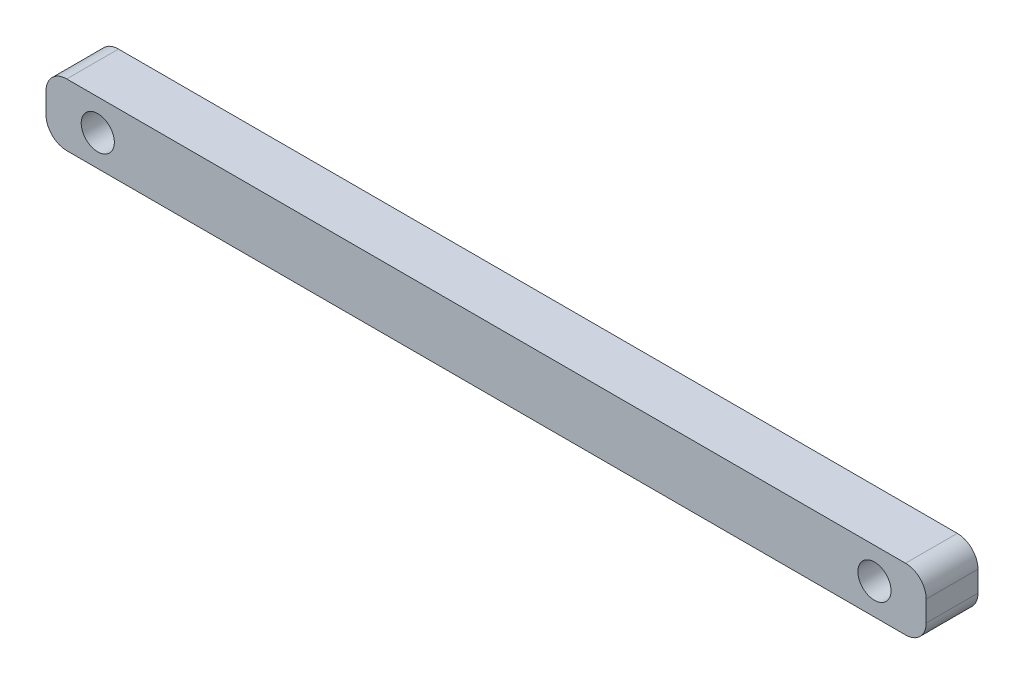
ISO-10303-21;
HEADER;
FILE_DESCRIPTION(('STEP AP214'),'2;1');
FILE_NAME('part.step','',(''),(''),'','','');
FILE_SCHEMA(('AUTOMOTIVE_DESIGN { 1 0 10303 214 1 1 1 1 }'));
ENDSEC;
DATA;
#1=APPLICATION_CONTEXT('core data for automotive mechanical design processes');
#2=APPLICATION_PROTOCOL_DEFINITION('international standard','automotive_design',2000,#1);
#3=PRODUCT_CONTEXT('',#1,'mechanical');
#4=PRODUCT('Part','Part','',(#3));
#5=PRODUCT_RELATED_PRODUCT_CATEGORY('part','',(#4));
#6=PRODUCT_DEFINITION_FORMATION('','',#4);
#7=PRODUCT_DEFINITION_CONTEXT('part definition',#1,'design');
#8=PRODUCT_DEFINITION('design','',#6,#7);
#9=PRODUCT_DEFINITION_SHAPE('','',#8);
#10=(LENGTH_UNIT() NAMED_UNIT(*) SI_UNIT(.MILLI.,.METRE.));
#11=(NAMED_UNIT(*) PLANE_ANGLE_UNIT() SI_UNIT($,.RADIAN.));
#12=(NAMED_UNIT(*) SI_UNIT($,.STERADIAN.) SOLID_ANGLE_UNIT());
#13=UNCERTAINTY_MEASURE_WITH_UNIT(LENGTH_MEASURE(1.E-05),#10,'distance_accuracy_value','');
#14=(GEOMETRIC_REPRESENTATION_CONTEXT(3) GLOBAL_UNCERTAINTY_ASSIGNED_CONTEXT((#13)) GLOBAL_UNIT_ASSIGNED_CONTEXT((#10,
#11,#12)) REPRESENTATION_CONTEXT('',''));
#15=CARTESIAN_POINT('',(0.,0.,0.));
#16=DIRECTION('',(0.,0.,1.));
#17=DIRECTION('',(1.,0.,0.));
#18=AXIS2_PLACEMENT_3D('',#15,#16,#17);
#19=CARTESIAN_POINT('',(40.5,-1.,5.));
#20=DIRECTION('',(0.,0.,1.));
#21=DIRECTION('',(1.,0.,0.));
#22=AXIS2_PLACEMENT_3D('',#19,#20,#21);
#23=PLANE('',#22);
#24=CARTESIAN_POINT('',(-37.5,0.,5.));
#25=DIRECTION('',(0.,0.,1.));
#26=DIRECTION('',(1.,0.,0.));
#27=AXIS2_PLACEMENT_3D('',#24,#25,#26);
#28=CIRCLE('',#27,1.6);
#29=CARTESIAN_POINT('',(-35.9,0.,5.));
#30=VERTEX_POINT('',#29);
#31=EDGE_CURVE('E140',#30,#30,#28,.T.);
#32=ORIENTED_EDGE('',*,*,#31,.F.);
#33=EDGE_LOOP('',(#32));
#34=FACE_BOUND('',#33,.T.);
#35=CARTESIAN_POINT('',(40.5,-1.,5.));
#36=DIRECTION('',(0.,0.,1.));
#37=DIRECTION('',(1.,0.,0.));
#38=AXIS2_PLACEMENT_3D('',#35,#36,#37);
#39=CIRCLE('',#38,2.);
#40=CARTESIAN_POINT('',(40.5,-3.,5.));
#41=VERTEX_POINT('',#40);
#42=CARTESIAN_POINT('',(42.5,-1.,5.));
#43=VERTEX_POINT('',#42);
#44=EDGE_CURVE('E151',#41,#43,#39,.T.);
#45=ORIENTED_EDGE('',*,*,#44,.T.);
#46=DIRECTION('',(0.,1.,0.));
#47=VECTOR('',#46,1.);
#48=CARTESIAN_POINT('',(42.5,1.,5.));
#49=LINE('',#48,#47);
#50=CARTESIAN_POINT('',(42.5,1.,5.));
#51=VERTEX_POINT('',#50);
#52=EDGE_CURVE('E99',#43,#51,#49,.T.);
#53=ORIENTED_EDGE('',*,*,#52,.T.);
#54=CARTESIAN_POINT('',(40.5,1.,5.));
#55=DIRECTION('',(0.,0.,1.));
#56=DIRECTION('',(-1.,0.,0.));
#57=AXIS2_PLACEMENT_3D('',#54,#55,#56);
#58=CIRCLE('',#57,2.);
#59=CARTESIAN_POINT('',(40.5,3.,5.));
#60=VERTEX_POINT('',#59);
#61=EDGE_CURVE('E166',#51,#60,#58,.T.);
#62=ORIENTED_EDGE('',*,*,#61,.T.);
#63=DIRECTION('',(-1.,0.,0.));
#64=VECTOR('',#63,1.);
#65=CARTESIAN_POINT('',(-40.5,3.,5.));
#66=LINE('',#65,#64);
#67=CARTESIAN_POINT('',(-40.5,3.,5.));
#68=VERTEX_POINT('',#67);
#69=EDGE_CURVE('E179',#60,#68,#66,.T.);
#70=ORIENTED_EDGE('',*,*,#69,.T.);
#71=CARTESIAN_POINT('',(-40.5,1.,5.));
#72=DIRECTION('',(0.,0.,1.));
#73=DIRECTION('',(1.,0.,0.));
#74=AXIS2_PLACEMENT_3D('',#71,#72,#73);
#75=CIRCLE('',#74,2.);
#76=CARTESIAN_POINT('',(-42.5,0.999999999999999,5.));
#77=VERTEX_POINT('',#76);
#78=EDGE_CURVE('E118',#68,#77,#75,.T.);
#79=ORIENTED_EDGE('',*,*,#78,.T.);
#80=DIRECTION('',(0.,-1.,0.));
#81=VECTOR('',#80,1.);
#82=CARTESIAN_POINT('',(-42.5,0.999999999999999,5.));
#83=LINE('',#82,#81);
#84=CARTESIAN_POINT('',(-42.5,-1.,5.));
#85=VERTEX_POINT('',#84);
#86=EDGE_CURVE('E112',#77,#85,#83,.T.);
#87=ORIENTED_EDGE('',*,*,#86,.T.);
#88=CARTESIAN_POINT('',(-40.5,-1.,5.));
#89=DIRECTION('',(0.,0.,1.));
#90=DIRECTION('',(1.,0.,0.));
#91=AXIS2_PLACEMENT_3D('',#88,#89,#90);
#92=CIRCLE('',#91,2.);
#93=CARTESIAN_POINT('',(-40.5,-3.,5.));
#94=VERTEX_POINT('',#93);
#95=EDGE_CURVE('E116',#85,#94,#92,.T.);
#96=ORIENTED_EDGE('',*,*,#95,.T.);
#97=DIRECTION('',(1.,0.,0.));
#98=VECTOR('',#97,1.);
#99=CARTESIAN_POINT('',(-40.5,-3.,5.));
#100=LINE('',#99,#98);
#101=EDGE_CURVE('E56',#94,#41,#100,.T.);
#102=ORIENTED_EDGE('',*,*,#101,.T.);
#103=EDGE_LOOP('',(#45,#53,#62,#70,#79,#87,#96,#102));
#104=FACE_BOUND('',#103,.T.);
#105=CARTESIAN_POINT('',(37.5,0.,5.));
#106=DIRECTION('',(0.,0.,1.));
#107=DIRECTION('',(1.,0.,0.));
#108=AXIS2_PLACEMENT_3D('',#105,#106,#107);
#109=CIRCLE('',#108,1.6);
#110=CARTESIAN_POINT('',(39.1,0.,5.));
#111=VERTEX_POINT('',#110);
#112=EDGE_CURVE('E188',#111,#111,#109,.T.);
#113=ORIENTED_EDGE('',*,*,#112,.F.);
#114=EDGE_LOOP('',(#113));
#115=FACE_BOUND('',#114,.T.);
#116=ADVANCED_FACE('F39',(#34,#104,#115),#23,.T.);
#117=CARTESIAN_POINT('',(40.5,-1.,0.));
#118=DIRECTION('',(0.,0.,1.));
#119=DIRECTION('',(1.,0.,0.));
#120=AXIS2_PLACEMENT_3D('',#117,#118,#119);
#121=PLANE('',#120);
#122=CARTESIAN_POINT('',(40.5,-1.,0.));
#123=DIRECTION('',(0.,0.,1.));
#124=DIRECTION('',(1.,0.,0.));
#125=AXIS2_PLACEMENT_3D('',#122,#123,#124);
#126=CIRCLE('',#125,2.);
#127=CARTESIAN_POINT('',(40.5,-3.,0.));
#128=VERTEX_POINT('',#127);
#129=CARTESIAN_POINT('',(42.5,-1.,0.));
#130=VERTEX_POINT('',#129);
#131=EDGE_CURVE('E136',#128,#130,#126,.T.);
#132=ORIENTED_EDGE('',*,*,#131,.F.);
#133=DIRECTION('',(1.,0.,0.));
#134=VECTOR('',#133,1.);
#135=CARTESIAN_POINT('',(-40.5,-3.,0.));
#136=LINE('',#135,#134);
#137=CARTESIAN_POINT('',(-40.5,-3.,0.));
#138=VERTEX_POINT('',#137);
#139=EDGE_CURVE('E91',#138,#128,#136,.T.);
#140=ORIENTED_EDGE('',*,*,#139,.F.);
#141=CARTESIAN_POINT('',(-40.5,-1.,0.));
#142=DIRECTION('',(0.,0.,1.));
#143=DIRECTION('',(1.,0.,0.));
#144=AXIS2_PLACEMENT_3D('',#141,#142,#143);
#145=CIRCLE('',#144,2.);
#146=CARTESIAN_POINT('',(-42.5,-1.,0.));
#147=VERTEX_POINT('',#146);
#148=EDGE_CURVE('E85',#147,#138,#145,.T.);
#149=ORIENTED_EDGE('',*,*,#148,.F.);
#150=DIRECTION('',(0.,-1.,0.));
#151=VECTOR('',#150,1.);
#152=CARTESIAN_POINT('',(-42.5,0.999999999999999,0.));
#153=LINE('',#152,#151);
#154=CARTESIAN_POINT('',(-42.5,0.999999999999999,0.));
#155=VERTEX_POINT('',#154);
#156=EDGE_CURVE('E126',#155,#147,#153,.T.);
#157=ORIENTED_EDGE('',*,*,#156,.F.);
#158=CARTESIAN_POINT('',(-40.5,1.,0.));
#159=DIRECTION('',(0.,0.,1.));
#160=DIRECTION('',(1.,0.,0.));
#161=AXIS2_PLACEMENT_3D('',#158,#159,#160);
#162=CIRCLE('',#161,2.);
#163=CARTESIAN_POINT('',(-40.5,3.,0.));
#164=VERTEX_POINT('',#163);
#165=EDGE_CURVE('E146',#164,#155,#162,.T.);
#166=ORIENTED_EDGE('',*,*,#165,.F.);
#167=DIRECTION('',(-1.,0.,0.));
#168=VECTOR('',#167,1.);
#169=CARTESIAN_POINT('',(-40.5,3.,0.));
#170=LINE('',#169,#168);
#171=CARTESIAN_POINT('',(40.5,3.,0.));
#172=VERTEX_POINT('',#171);
#173=EDGE_CURVE('E144',#172,#164,#170,.T.);
#174=ORIENTED_EDGE('',*,*,#173,.F.);
#175=CARTESIAN_POINT('',(40.5,1.,0.));
#176=DIRECTION('',(0.,0.,1.));
#177=DIRECTION('',(-1.,0.,0.));
#178=AXIS2_PLACEMENT_3D('',#175,#176,#177);
#179=CIRCLE('',#178,2.);
#180=CARTESIAN_POINT('',(42.5,1.,0.));
#181=VERTEX_POINT('',#180);
#182=EDGE_CURVE('E142',#181,#172,#179,.T.);
#183=ORIENTED_EDGE('',*,*,#182,.F.);
#184=DIRECTION('',(0.,1.,0.));
#185=VECTOR('',#184,1.);
#186=CARTESIAN_POINT('',(42.5,1.,0.));
#187=LINE('',#186,#185);
#188=EDGE_CURVE('E139',#130,#181,#187,.T.);
#189=ORIENTED_EDGE('',*,*,#188,.F.);
#190=EDGE_LOOP('',(#132,#140,#149,#157,#166,#174,#183,#189));
#191=FACE_BOUND('',#190,.T.);
#192=CARTESIAN_POINT('',(-37.5,0.,0.));
#193=DIRECTION('',(0.,0.,1.));
#194=DIRECTION('',(1.,0.,0.));
#195=AXIS2_PLACEMENT_3D('',#192,#193,#194);
#196=CIRCLE('',#195,1.6);
#197=CARTESIAN_POINT('',(-35.9,0.,0.));
#198=VERTEX_POINT('',#197);
#199=EDGE_CURVE('E185',#198,#198,#196,.T.);
#200=ORIENTED_EDGE('',*,*,#199,.T.);
#201=EDGE_LOOP('',(#200));
#202=FACE_BOUND('',#201,.T.);
#203=CARTESIAN_POINT('',(37.5,0.,0.));
#204=DIRECTION('',(0.,0.,1.));
#205=DIRECTION('',(1.,0.,0.));
#206=AXIS2_PLACEMENT_3D('',#203,#204,#205);
#207=CIRCLE('',#206,1.6);
#208=CARTESIAN_POINT('',(39.1,0.,0.));
#209=VERTEX_POINT('',#208);
#210=EDGE_CURVE('E191',#209,#209,#207,.T.);
#211=ORIENTED_EDGE('',*,*,#210,.T.);
#212=EDGE_LOOP('',(#211));
#213=FACE_BOUND('',#212,.T.);
#214=ADVANCED_FACE('F170',(#191,#202,#213),#121,.F.);
#215=CARTESIAN_POINT('',(40.5,-1.,5.));
#216=DIRECTION('',(0.,0.,-1.));
#217=DIRECTION('',(-1.,0.,0.));
#218=AXIS2_PLACEMENT_3D('',#215,#216,#217);
#219=CYLINDRICAL_SURFACE('',#218,2.);
#220=ORIENTED_EDGE('',*,*,#131,.T.);
#221=DIRECTION('',(0.,0.,-1.));
#222=VECTOR('',#221,1.);
#223=CARTESIAN_POINT('',(42.5,-1.,5.));
#224=LINE('',#223,#222);
#225=EDGE_CURVE('E11',#43,#130,#224,.T.);
#226=ORIENTED_EDGE('',*,*,#225,.F.);
#227=ORIENTED_EDGE('',*,*,#44,.F.);
#228=DIRECTION('',(0.,0.,-1.));
#229=VECTOR('',#228,1.);
#230=CARTESIAN_POINT('',(40.5,-3.,5.));
#231=LINE('',#230,#229);
#232=EDGE_CURVE('E132',#41,#128,#231,.T.);
#233=ORIENTED_EDGE('',*,*,#232,.T.);
#234=EDGE_LOOP('',(#220,#226,#227,#233));
#235=FACE_BOUND('',#234,.T.);
#236=ADVANCED_FACE('F41',(#235),#219,.T.);
#237=CARTESIAN_POINT('',(42.5,1.,5.));
#238=DIRECTION('',(-1.,0.,0.));
#239=DIRECTION('',(0.,0.,1.));
#240=AXIS2_PLACEMENT_3D('',#237,#238,#239);
#241=PLANE('',#240);
#242=ORIENTED_EDGE('',*,*,#188,.T.);
#243=DIRECTION('',(0.,0.,-1.));
#244=VECTOR('',#243,1.);
#245=CARTESIAN_POINT('',(42.5,1.,5.));
#246=LINE('',#245,#244);
#247=EDGE_CURVE('E48',#51,#181,#246,.T.);
#248=ORIENTED_EDGE('',*,*,#247,.F.);
#249=ORIENTED_EDGE('',*,*,#52,.F.);
#250=ORIENTED_EDGE('',*,*,#225,.T.);
#251=EDGE_LOOP('',(#242,#248,#249,#250));
#252=FACE_BOUND('',#251,.T.);
#253=ADVANCED_FACE('F223',(#252),#241,.F.);
#254=CARTESIAN_POINT('',(40.5,1.,5.));
#255=DIRECTION('',(0.,0.,-1.));
#256=DIRECTION('',(-1.,0.,0.));
#257=AXIS2_PLACEMENT_3D('',#254,#255,#256);
#258=CYLINDRICAL_SURFACE('',#257,2.);
#259=ORIENTED_EDGE('',*,*,#182,.T.);
#260=DIRECTION('',(0.,0.,-1.));
#261=VECTOR('',#260,1.);
#262=CARTESIAN_POINT('',(40.5,3.,5.));
#263=LINE('',#262,#261);
#264=EDGE_CURVE('E158',#60,#172,#263,.T.);
#265=ORIENTED_EDGE('',*,*,#264,.F.);
#266=ORIENTED_EDGE('',*,*,#61,.F.);
#267=ORIENTED_EDGE('',*,*,#247,.T.);
#268=EDGE_LOOP('',(#259,#265,#266,#267));
#269=FACE_BOUND('',#268,.T.);
#270=ADVANCED_FACE('F164',(#269),#258,.T.);
#271=CARTESIAN_POINT('',(-40.5,3.,5.));
#272=DIRECTION('',(0.,-1.,0.));
#273=DIRECTION('',(0.,0.,-1.));
#274=AXIS2_PLACEMENT_3D('',#271,#272,#273);
#275=PLANE('',#274);
#276=ORIENTED_EDGE('',*,*,#173,.T.);
#277=DIRECTION('',(0.,0.,-1.));
#278=VECTOR('',#277,1.);
#279=CARTESIAN_POINT('',(-40.5,3.,5.));
#280=LINE('',#279,#278);
#281=EDGE_CURVE('E155',#68,#164,#280,.T.);
#282=ORIENTED_EDGE('',*,*,#281,.F.);
#283=ORIENTED_EDGE('',*,*,#69,.F.);
#284=ORIENTED_EDGE('',*,*,#264,.T.);
#285=EDGE_LOOP('',(#276,#282,#283,#284));
#286=FACE_BOUND('',#285,.T.);
#287=ADVANCED_FACE('F175',(#286),#275,.F.);
#288=CARTESIAN_POINT('',(-40.5,1.,5.));
#289=DIRECTION('',(0.,0.,-1.));
#290=DIRECTION('',(-1.,0.,0.));
#291=AXIS2_PLACEMENT_3D('',#288,#289,#290);
#292=CYLINDRICAL_SURFACE('',#291,2.);
#293=ORIENTED_EDGE('',*,*,#165,.T.);
#294=DIRECTION('',(0.,0.,-1.));
#295=VECTOR('',#294,1.);
#296=CARTESIAN_POINT('',(-42.5,0.999999999999999,5.));
#297=LINE('',#296,#295);
#298=EDGE_CURVE('E127',#77,#155,#297,.T.);
#299=ORIENTED_EDGE('',*,*,#298,.F.);
#300=ORIENTED_EDGE('',*,*,#78,.F.);
#301=ORIENTED_EDGE('',*,*,#281,.T.);
#302=EDGE_LOOP('',(#293,#299,#300,#301));
#303=FACE_BOUND('',#302,.T.);
#304=ADVANCED_FACE('F178',(#303),#292,.T.);
#305=CARTESIAN_POINT('',(-42.5,0.999999999999999,5.));
#306=DIRECTION('',(1.,0.,0.));
#307=DIRECTION('',(0.,0.,-1.));
#308=AXIS2_PLACEMENT_3D('',#305,#306,#307);
#309=PLANE('',#308);
#310=ORIENTED_EDGE('',*,*,#156,.T.);
#311=DIRECTION('',(0.,0.,-1.));
#312=VECTOR('',#311,1.);
#313=CARTESIAN_POINT('',(-42.5,-1.,5.));
#314=LINE('',#313,#312);
#315=EDGE_CURVE('E123',#85,#147,#314,.T.);
#316=ORIENTED_EDGE('',*,*,#315,.F.);
#317=ORIENTED_EDGE('',*,*,#86,.F.);
#318=ORIENTED_EDGE('',*,*,#298,.T.);
#319=EDGE_LOOP('',(#310,#316,#317,#318));
#320=FACE_BOUND('',#319,.T.);
#321=ADVANCED_FACE('F124',(#320),#309,.F.);
#322=CARTESIAN_POINT('',(-40.5,-1.,5.));
#323=DIRECTION('',(0.,0.,-1.));
#324=DIRECTION('',(-1.,0.,0.));
#325=AXIS2_PLACEMENT_3D('',#322,#323,#324);
#326=CYLINDRICAL_SURFACE('',#325,2.);
#327=ORIENTED_EDGE('',*,*,#148,.T.);
#328=DIRECTION('',(0.,0.,-1.));
#329=VECTOR('',#328,1.);
#330=CARTESIAN_POINT('',(-40.5,-3.,5.));
#331=LINE('',#330,#329);
#332=EDGE_CURVE('E128',#94,#138,#331,.T.);
#333=ORIENTED_EDGE('',*,*,#332,.F.);
#334=ORIENTED_EDGE('',*,*,#95,.F.);
#335=ORIENTED_EDGE('',*,*,#315,.T.);
#336=EDGE_LOOP('',(#327,#333,#334,#335));
#337=FACE_BOUND('',#336,.T.);
#338=ADVANCED_FACE('F130',(#337),#326,.T.);
#339=CARTESIAN_POINT('',(-40.5,-3.,5.));
#340=DIRECTION('',(0.,1.,0.));
#341=DIRECTION('',(0.,0.,1.));
#342=AXIS2_PLACEMENT_3D('',#339,#340,#341);
#343=PLANE('',#342);
#344=ORIENTED_EDGE('',*,*,#139,.T.);
#345=ORIENTED_EDGE('',*,*,#232,.F.);
#346=ORIENTED_EDGE('',*,*,#101,.F.);
#347=ORIENTED_EDGE('',*,*,#332,.T.);
#348=EDGE_LOOP('',(#344,#345,#346,#347));
#349=FACE_BOUND('',#348,.T.);
#350=ADVANCED_FACE('F211',(#349),#343,.F.);
#351=CARTESIAN_POINT('',(-37.5,0.,5.));
#352=DIRECTION('',(0.,0.,-1.));
#353=DIRECTION('',(-1.,0.,0.));
#354=AXIS2_PLACEMENT_3D('',#351,#352,#353);
#355=CYLINDRICAL_SURFACE('',#354,1.6);
#356=ORIENTED_EDGE('',*,*,#31,.T.);
#357=EDGE_LOOP('',(#356));
#358=FACE_BOUND('',#357,.T.);
#359=ORIENTED_EDGE('',*,*,#199,.F.);
#360=EDGE_LOOP('',(#359));
#361=FACE_BOUND('',#360,.T.);
#362=ADVANCED_FACE('F208',(#358,#361),#355,.F.);
#363=CARTESIAN_POINT('',(37.5,0.,5.));
#364=DIRECTION('',(0.,0.,-1.));
#365=DIRECTION('',(-1.,0.,0.));
#366=AXIS2_PLACEMENT_3D('',#363,#364,#365);
#367=CYLINDRICAL_SURFACE('',#366,1.6);
#368=ORIENTED_EDGE('',*,*,#112,.T.);
#369=EDGE_LOOP('',(#368));
#370=FACE_BOUND('',#369,.T.);
#371=ORIENTED_EDGE('',*,*,#210,.F.);
#372=EDGE_LOOP('',(#371));
#373=FACE_BOUND('',#372,.T.);
#374=ADVANCED_FACE('F197',(#370,#373),#367,.F.);
#375=CLOSED_SHELL('',(#116,#214,#236,#253,#270,#287,#304,#321,#338,#350,#362,#374));
#376=MANIFOLD_SOLID_BREP('B2',#375);
#377=ADVANCED_BREP_SHAPE_REPRESENTATION('',(#18,#376),#14);
#378=SHAPE_DEFINITION_REPRESENTATION(#9,#377);
ENDSEC;
END-ISO-10303-21;
